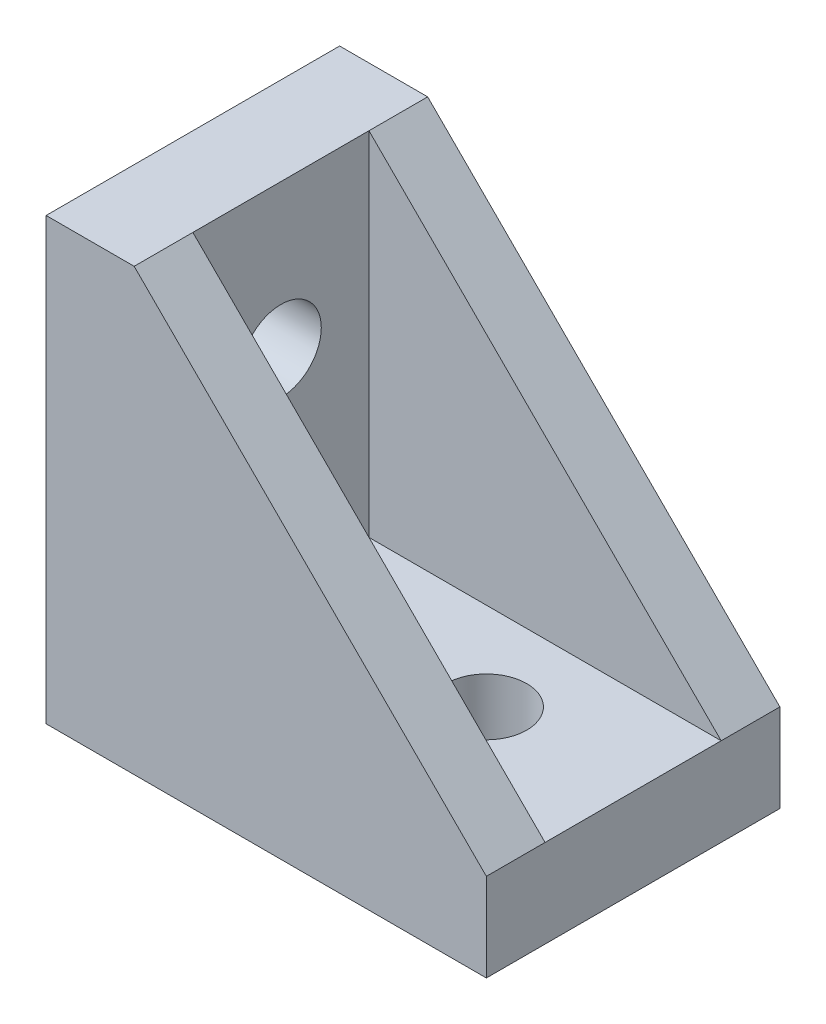
ISO-10303-21;
HEADER;
FILE_DESCRIPTION(('STEP AP214'),'2;1');
FILE_NAME('part.step','',(''),(''),'','','');
FILE_SCHEMA(('AUTOMOTIVE_DESIGN { 1 0 10303 214 1 1 1 1 }'));
ENDSEC;
DATA;
#1=APPLICATION_CONTEXT('core data for automotive mechanical design processes');
#2=APPLICATION_PROTOCOL_DEFINITION('international standard','automotive_design',2000,#1);
#3=PRODUCT_CONTEXT('',#1,'mechanical');
#4=PRODUCT('Part','Part','',(#3));
#5=PRODUCT_RELATED_PRODUCT_CATEGORY('part','',(#4));
#6=PRODUCT_DEFINITION_FORMATION('','',#4);
#7=PRODUCT_DEFINITION_CONTEXT('part definition',#1,'design');
#8=PRODUCT_DEFINITION('design','',#6,#7);
#9=PRODUCT_DEFINITION_SHAPE('','',#8);
#10=(LENGTH_UNIT() NAMED_UNIT(*) SI_UNIT(.MILLI.,.METRE.));
#11=(NAMED_UNIT(*) PLANE_ANGLE_UNIT() SI_UNIT($,.RADIAN.));
#12=(NAMED_UNIT(*) SI_UNIT($,.STERADIAN.) SOLID_ANGLE_UNIT());
#13=UNCERTAINTY_MEASURE_WITH_UNIT(LENGTH_MEASURE(1.E-05),#10,'distance_accuracy_value','');
#14=(GEOMETRIC_REPRESENTATION_CONTEXT(3) GLOBAL_UNCERTAINTY_ASSIGNED_CONTEXT((#13)) GLOBAL_UNIT_ASSIGNED_CONTEXT((#10,
#11,#12)) REPRESENTATION_CONTEXT('',''));
#15=CARTESIAN_POINT('',(0.,0.,0.));
#16=DIRECTION('',(0.,0.,1.));
#17=DIRECTION('',(1.,0.,0.));
#18=AXIS2_PLACEMENT_3D('',#15,#16,#17);
#19=CARTESIAN_POINT('',(6.,0.,10.));
#20=DIRECTION('',(1.,0.,0.));
#21=DIRECTION('',(0.,1.,0.));
#22=AXIS2_PLACEMENT_3D('',#19,#20,#21);
#23=PLANE('',#22);
#24=DIRECTION('',(0.,-1.,0.));
#25=VECTOR('',#24,1.);
#26=CARTESIAN_POINT('',(6.,6.,-6.));
#27=LINE('',#26,#25);
#28=CARTESIAN_POINT('',(6.,30.,-6.));
#29=VERTEX_POINT('',#28);
#30=CARTESIAN_POINT('',(6.,6.,-6.));
#31=VERTEX_POINT('',#30);
#32=EDGE_CURVE('E68',#29,#31,#27,.T.);
#33=ORIENTED_EDGE('',*,*,#32,.F.);
#34=DIRECTION('',(0.,0.,-1.));
#35=VECTOR('',#34,1.);
#36=CARTESIAN_POINT('',(6.,30.,10.));
#37=LINE('',#36,#35);
#38=CARTESIAN_POINT('',(6.,30.,6.));
#39=VERTEX_POINT('',#38);
#40=EDGE_CURVE('E12',#39,#29,#37,.T.);
#41=ORIENTED_EDGE('',*,*,#40,.F.);
#42=DIRECTION('',(0.,-1.,0.));
#43=VECTOR('',#42,1.);
#44=CARTESIAN_POINT('',(6.,6.,6.));
#45=LINE('',#44,#43);
#46=CARTESIAN_POINT('',(6.,6.,6.));
#47=VERTEX_POINT('',#46);
#48=EDGE_CURVE('E149',#39,#47,#45,.T.);
#49=ORIENTED_EDGE('',*,*,#48,.T.);
#50=DIRECTION('',(0.,0.,-1.));
#51=VECTOR('',#50,1.);
#52=CARTESIAN_POINT('',(6.,6.,10.));
#53=LINE('',#52,#51);
#54=EDGE_CURVE('E118',#47,#31,#53,.T.);
#55=ORIENTED_EDGE('',*,*,#54,.T.);
#56=EDGE_LOOP('',(#33,#41,#49,#55));
#57=FACE_BOUND('',#56,.T.);
#58=CARTESIAN_POINT('',(6.,20.,0.));
#59=DIRECTION('',(1.,0.,0.));
#60=DIRECTION('',(0.,0.,-1.));
#61=AXIS2_PLACEMENT_3D('',#58,#59,#60);
#62=CIRCLE('',#61,2.74999999999999);
#63=CARTESIAN_POINT('',(6.,20.,-2.74999999999999));
#64=VERTEX_POINT('',#63);
#65=EDGE_CURVE('E180',#64,#64,#62,.T.);
#66=ORIENTED_EDGE('',*,*,#65,.F.);
#67=EDGE_LOOP('',(#66));
#68=FACE_BOUND('',#67,.T.);
#69=ADVANCED_FACE('F46',(#57,#68),#23,.T.);
#70=CARTESIAN_POINT('',(0.,6.,10.));
#71=DIRECTION('',(0.,1.,0.));
#72=DIRECTION('',(1.,0.,0.));
#73=AXIS2_PLACEMENT_3D('',#70,#71,#72);
#74=PLANE('',#73);
#75=DIRECTION('',(1.,0.,0.));
#76=VECTOR('',#75,1.);
#77=CARTESIAN_POINT('',(6.,6.,-6.));
#78=LINE('',#77,#76);
#79=CARTESIAN_POINT('',(30.,6.00000000000001,-6.));
#80=VERTEX_POINT('',#79);
#81=EDGE_CURVE('E61',#31,#80,#78,.T.);
#82=ORIENTED_EDGE('',*,*,#81,.F.);
#83=ORIENTED_EDGE('',*,*,#54,.F.);
#84=DIRECTION('',(1.,0.,0.));
#85=VECTOR('',#84,1.);
#86=CARTESIAN_POINT('',(6.,6.,6.));
#87=LINE('',#86,#85);
#88=CARTESIAN_POINT('',(30.,5.99999999999999,6.));
#89=VERTEX_POINT('',#88);
#90=EDGE_CURVE('E115',#47,#89,#87,.T.);
#91=ORIENTED_EDGE('',*,*,#90,.T.);
#92=DIRECTION('',(0.,0.,-1.));
#93=VECTOR('',#92,1.);
#94=CARTESIAN_POINT('',(30.,5.99999999999999,10.));
#95=LINE('',#94,#93);
#96=EDGE_CURVE('E111',#89,#80,#95,.T.);
#97=ORIENTED_EDGE('',*,*,#96,.T.);
#98=EDGE_LOOP('',(#82,#83,#91,#97));
#99=FACE_BOUND('',#98,.T.);
#100=CARTESIAN_POINT('',(20.,6.,0.));
#101=DIRECTION('',(0.,-1.,0.));
#102=DIRECTION('',(0.,0.,-1.));
#103=AXIS2_PLACEMENT_3D('',#100,#101,#102);
#104=CIRCLE('',#103,2.74999999999999);
#105=CARTESIAN_POINT('',(20.,6.,-2.74999999999999));
#106=VERTEX_POINT('',#105);
#107=EDGE_CURVE('E159',#106,#106,#104,.T.);
#108=ORIENTED_EDGE('',*,*,#107,.T.);
#109=EDGE_LOOP('',(#108));
#110=FACE_BOUND('',#109,.T.);
#111=ADVANCED_FACE('F113',(#99,#110),#74,.T.);
#112=CARTESIAN_POINT('',(0.,0.,10.));
#113=DIRECTION('',(-1.,0.,0.));
#114=DIRECTION('',(0.,0.,1.));
#115=AXIS2_PLACEMENT_3D('',#112,#113,#114);
#116=PLANE('',#115);
#117=CARTESIAN_POINT('',(0.,20.,0.));
#118=DIRECTION('',(-1.,0.,0.));
#119=DIRECTION('',(0.,0.,1.));
#120=AXIS2_PLACEMENT_3D('',#117,#118,#119);
#121=CIRCLE('',#120,2.74999999999999);
#122=CARTESIAN_POINT('',(0.,20.,2.74999999999999));
#123=VERTEX_POINT('',#122);
#124=EDGE_CURVE('E183',#123,#123,#121,.T.);
#125=ORIENTED_EDGE('',*,*,#124,.F.);
#126=EDGE_LOOP('',(#125));
#127=FACE_BOUND('',#126,.T.);
#128=DIRECTION('',(0.,1.,0.));
#129=VECTOR('',#128,1.);
#130=CARTESIAN_POINT('',(0.,0.,-10.));
#131=LINE('',#130,#129);
#132=CARTESIAN_POINT('',(0.,0.,-10.));
#133=VERTEX_POINT('',#132);
#134=CARTESIAN_POINT('',(0.,30.,-10.));
#135=VERTEX_POINT('',#134);
#136=EDGE_CURVE('E186',#133,#135,#131,.T.);
#137=ORIENTED_EDGE('',*,*,#136,.F.);
#138=DIRECTION('',(0.,0.,-1.));
#139=VECTOR('',#138,1.);
#140=CARTESIAN_POINT('',(0.,0.,10.));
#141=LINE('',#140,#139);
#142=CARTESIAN_POINT('',(0.,0.,10.));
#143=VERTEX_POINT('',#142);
#144=EDGE_CURVE('E177',#143,#133,#141,.T.);
#145=ORIENTED_EDGE('',*,*,#144,.F.);
#146=DIRECTION('',(0.,1.,0.));
#147=VECTOR('',#146,1.);
#148=CARTESIAN_POINT('',(0.,0.,10.));
#149=LINE('',#148,#147);
#150=CARTESIAN_POINT('',(0.,30.,10.));
#151=VERTEX_POINT('',#150);
#152=EDGE_CURVE('E187',#143,#151,#149,.T.);
#153=ORIENTED_EDGE('',*,*,#152,.T.);
#154=DIRECTION('',(0.,0.,-1.));
#155=VECTOR('',#154,1.);
#156=CARTESIAN_POINT('',(0.,30.,10.));
#157=LINE('',#156,#155);
#158=EDGE_CURVE('E54',#151,#135,#157,.T.);
#159=ORIENTED_EDGE('',*,*,#158,.T.);
#160=EDGE_LOOP('',(#137,#145,#153,#159));
#161=FACE_BOUND('',#160,.T.);
#162=ADVANCED_FACE('F48',(#127,#161),#116,.T.);
#163=CARTESIAN_POINT('',(0.,30.,10.));
#164=DIRECTION('',(0.,1.,0.));
#165=DIRECTION('',(0.,0.,1.));
#166=AXIS2_PLACEMENT_3D('',#163,#164,#165);
#167=PLANE('',#166);
#168=DIRECTION('',(1.,0.,0.));
#169=VECTOR('',#168,1.);
#170=CARTESIAN_POINT('',(0.,30.,-10.));
#171=LINE('',#170,#169);
#172=CARTESIAN_POINT('',(6.,30.,-10.));
#173=VERTEX_POINT('',#172);
#174=EDGE_CURVE('E191',#135,#173,#171,.T.);
#175=ORIENTED_EDGE('',*,*,#174,.F.);
#176=ORIENTED_EDGE('',*,*,#158,.F.);
#177=DIRECTION('',(1.,0.,0.));
#178=VECTOR('',#177,1.);
#179=CARTESIAN_POINT('',(0.,30.,10.));
#180=LINE('',#179,#178);
#181=CARTESIAN_POINT('',(6.,30.,10.));
#182=VERTEX_POINT('',#181);
#183=EDGE_CURVE('E190',#151,#182,#180,.T.);
#184=ORIENTED_EDGE('',*,*,#183,.T.);
#185=DIRECTION('',(0.,0.,1.));
#186=VECTOR('',#185,1.);
#187=CARTESIAN_POINT('',(6.,30.,6.));
#188=LINE('',#187,#186);
#189=EDGE_CURVE('E157',#39,#182,#188,.T.);
#190=ORIENTED_EDGE('',*,*,#189,.F.);
#191=ORIENTED_EDGE('',*,*,#40,.T.);
#192=DIRECTION('',(0.,0.,-1.));
#193=VECTOR('',#192,1.);
#194=CARTESIAN_POINT('',(6.,30.,-6.));
#195=LINE('',#194,#193);
#196=EDGE_CURVE('E130',#29,#173,#195,.T.);
#197=ORIENTED_EDGE('',*,*,#196,.T.);
#198=EDGE_LOOP('',(#175,#176,#184,#190,#191,#197));
#199=FACE_BOUND('',#198,.T.);
#200=ADVANCED_FACE('F205',(#199),#167,.T.);
#201=CARTESIAN_POINT('',(0.,0.,10.));
#202=DIRECTION('',(0.,0.,1.));
#203=DIRECTION('',(1.,0.,0.));
#204=AXIS2_PLACEMENT_3D('',#201,#202,#203);
#205=PLANE('',#204);
#206=ORIENTED_EDGE('',*,*,#152,.F.);
#207=DIRECTION('',(1.,0.,0.));
#208=VECTOR('',#207,1.);
#209=CARTESIAN_POINT('',(0.,0.,10.));
#210=LINE('',#209,#208);
#211=CARTESIAN_POINT('',(30.,0.,10.));
#212=VERTEX_POINT('',#211);
#213=EDGE_CURVE('E166',#143,#212,#210,.T.);
#214=ORIENTED_EDGE('',*,*,#213,.T.);
#215=DIRECTION('',(0.,1.,0.));
#216=VECTOR('',#215,1.);
#217=CARTESIAN_POINT('',(30.,0.,10.));
#218=LINE('',#217,#216);
#219=CARTESIAN_POINT('',(30.,6.00000000000001,10.));
#220=VERTEX_POINT('',#219);
#221=EDGE_CURVE('E169',#212,#220,#218,.T.);
#222=ORIENTED_EDGE('',*,*,#221,.T.);
#223=DIRECTION('',(-0.707106781186548,0.707106781186547,0.));
#224=VECTOR('',#223,1.);
#225=CARTESIAN_POINT('',(6.,30.,10.));
#226=LINE('',#225,#224);
#227=EDGE_CURVE('E145',#220,#182,#226,.T.);
#228=ORIENTED_EDGE('',*,*,#227,.T.);
#229=ORIENTED_EDGE('',*,*,#183,.F.);
#230=EDGE_LOOP('',(#206,#214,#222,#228,#229));
#231=FACE_BOUND('',#230,.T.);
#232=ADVANCED_FACE('F216',(#231),#205,.T.);
#233=CARTESIAN_POINT('',(0.,0.,-10.));
#234=DIRECTION('',(0.,0.,1.));
#235=DIRECTION('',(1.,0.,0.));
#236=AXIS2_PLACEMENT_3D('',#233,#234,#235);
#237=PLANE('',#236);
#238=ORIENTED_EDGE('',*,*,#136,.T.);
#239=ORIENTED_EDGE('',*,*,#174,.T.);
#240=DIRECTION('',(-0.707106781186548,0.707106781186547,0.));
#241=VECTOR('',#240,1.);
#242=CARTESIAN_POINT('',(6.,30.,-10.));
#243=LINE('',#242,#241);
#244=CARTESIAN_POINT('',(30.,5.99999999999999,-10.));
#245=VERTEX_POINT('',#244);
#246=EDGE_CURVE('E139',#245,#173,#243,.T.);
#247=ORIENTED_EDGE('',*,*,#246,.F.);
#248=DIRECTION('',(0.,1.,0.));
#249=VECTOR('',#248,1.);
#250=CARTESIAN_POINT('',(30.,0.,-10.));
#251=LINE('',#250,#249);
#252=CARTESIAN_POINT('',(30.,0.,-10.));
#253=VERTEX_POINT('',#252);
#254=EDGE_CURVE('E125',#253,#245,#251,.T.);
#255=ORIENTED_EDGE('',*,*,#254,.F.);
#256=DIRECTION('',(1.,0.,0.));
#257=VECTOR('',#256,1.);
#258=CARTESIAN_POINT('',(0.,0.,-10.));
#259=LINE('',#258,#257);
#260=EDGE_CURVE('E165',#133,#253,#259,.T.);
#261=ORIENTED_EDGE('',*,*,#260,.F.);
#262=EDGE_LOOP('',(#238,#239,#247,#255,#261));
#263=FACE_BOUND('',#262,.T.);
#264=ADVANCED_FACE('F204',(#263),#237,.F.);
#265=CARTESIAN_POINT('',(6.,20.,0.));
#266=DIRECTION('',(1.,0.,0.));
#267=DIRECTION('',(0.,0.,-1.));
#268=AXIS2_PLACEMENT_3D('',#265,#266,#267);
#269=CYLINDRICAL_SURFACE('',#268,2.74999999999999);
#270=ORIENTED_EDGE('',*,*,#65,.T.);
#271=EDGE_LOOP('',(#270));
#272=FACE_BOUND('',#271,.T.);
#273=ORIENTED_EDGE('',*,*,#124,.T.);
#274=EDGE_LOOP('',(#273));
#275=FACE_BOUND('',#274,.T.);
#276=ADVANCED_FACE('F220',(#272,#275),#269,.F.);
#277=CARTESIAN_POINT('',(0.,0.,10.));
#278=DIRECTION('',(0.,-1.,0.));
#279=DIRECTION('',(0.,0.,1.));
#280=AXIS2_PLACEMENT_3D('',#277,#278,#279);
#281=PLANE('',#280);
#282=CARTESIAN_POINT('',(20.,0.,0.));
#283=DIRECTION('',(0.,1.,0.));
#284=DIRECTION('',(0.,0.,1.));
#285=AXIS2_PLACEMENT_3D('',#282,#283,#284);
#286=CIRCLE('',#285,2.74999999999999);
#287=CARTESIAN_POINT('',(20.,0.,2.74999999999999));
#288=VERTEX_POINT('',#287);
#289=EDGE_CURVE('E162',#288,#288,#286,.T.);
#290=ORIENTED_EDGE('',*,*,#289,.T.);
#291=EDGE_LOOP('',(#290));
#292=FACE_BOUND('',#291,.T.);
#293=ORIENTED_EDGE('',*,*,#260,.T.);
#294=DIRECTION('',(0.,0.,-1.));
#295=VECTOR('',#294,1.);
#296=CARTESIAN_POINT('',(30.,0.,10.));
#297=LINE('',#296,#295);
#298=EDGE_CURVE('E119',#212,#253,#297,.T.);
#299=ORIENTED_EDGE('',*,*,#298,.F.);
#300=ORIENTED_EDGE('',*,*,#213,.F.);
#301=ORIENTED_EDGE('',*,*,#144,.T.);
#302=EDGE_LOOP('',(#293,#299,#300,#301));
#303=FACE_BOUND('',#302,.T.);
#304=ADVANCED_FACE('F218',(#292,#303),#281,.T.);
#305=CARTESIAN_POINT('',(30.,0.,10.));
#306=DIRECTION('',(1.,0.,0.));
#307=DIRECTION('',(0.,0.,1.));
#308=AXIS2_PLACEMENT_3D('',#305,#306,#307);
#309=PLANE('',#308);
#310=ORIENTED_EDGE('',*,*,#254,.T.);
#311=DIRECTION('',(0.,0.,-1.));
#312=VECTOR('',#311,1.);
#313=CARTESIAN_POINT('',(30.,6.00000000000001,-6.));
#314=LINE('',#313,#312);
#315=EDGE_CURVE('E122',#80,#245,#314,.T.);
#316=ORIENTED_EDGE('',*,*,#315,.F.);
#317=ORIENTED_EDGE('',*,*,#96,.F.);
#318=DIRECTION('',(0.,0.,1.));
#319=VECTOR('',#318,1.);
#320=CARTESIAN_POINT('',(30.,6.00000000000001,6.));
#321=LINE('',#320,#319);
#322=EDGE_CURVE('E153',#89,#220,#321,.T.);
#323=ORIENTED_EDGE('',*,*,#322,.T.);
#324=ORIENTED_EDGE('',*,*,#221,.F.);
#325=ORIENTED_EDGE('',*,*,#298,.T.);
#326=EDGE_LOOP('',(#310,#316,#317,#323,#324,#325));
#327=FACE_BOUND('',#326,.T.);
#328=ADVANCED_FACE('F123',(#327),#309,.T.);
#329=CARTESIAN_POINT('',(20.,6.,0.));
#330=DIRECTION('',(0.,1.,0.));
#331=DIRECTION('',(0.,0.,-1.));
#332=AXIS2_PLACEMENT_3D('',#329,#330,#331);
#333=CYLINDRICAL_SURFACE('',#332,2.74999999999999);
#334=ORIENTED_EDGE('',*,*,#107,.F.);
#335=EDGE_LOOP('',(#334));
#336=FACE_BOUND('',#335,.T.);
#337=ORIENTED_EDGE('',*,*,#289,.F.);
#338=EDGE_LOOP('',(#337));
#339=FACE_BOUND('',#338,.T.);
#340=ADVANCED_FACE('F229',(#336,#339),#333,.F.);
#341=CARTESIAN_POINT('',(6.,30.,6.));
#342=DIRECTION('',(-0.707106781186547,-0.707106781186548,0.));
#343=DIRECTION('',(0.707106781186548,-0.707106781186547,0.));
#344=AXIS2_PLACEMENT_3D('',#341,#342,#343);
#345=PLANE('',#344);
#346=ORIENTED_EDGE('',*,*,#227,.F.);
#347=ORIENTED_EDGE('',*,*,#322,.F.);
#348=DIRECTION('',(-0.707106781186548,0.707106781186547,0.));
#349=VECTOR('',#348,1.);
#350=CARTESIAN_POINT('',(6.,30.,6.));
#351=LINE('',#350,#349);
#352=EDGE_CURVE('E146',#89,#39,#351,.T.);
#353=ORIENTED_EDGE('',*,*,#352,.T.);
#354=ORIENTED_EDGE('',*,*,#189,.T.);
#355=EDGE_LOOP('',(#346,#347,#353,#354));
#356=FACE_BOUND('',#355,.T.);
#357=ADVANCED_FACE('F212',(#356),#345,.F.);
#358=CARTESIAN_POINT('',(0.,0.,6.));
#359=DIRECTION('',(0.,0.,-1.));
#360=DIRECTION('',(1.,0.,0.));
#361=AXIS2_PLACEMENT_3D('',#358,#359,#360);
#362=PLANE('',#361);
#363=ORIENTED_EDGE('',*,*,#352,.F.);
#364=ORIENTED_EDGE('',*,*,#90,.F.);
#365=ORIENTED_EDGE('',*,*,#48,.F.);
#366=EDGE_LOOP('',(#363,#364,#365));
#367=FACE_BOUND('',#366,.T.);
#368=ADVANCED_FACE('F210',(#367),#362,.T.);
#369=CARTESIAN_POINT('',(6.,30.,-6.));
#370=DIRECTION('',(-0.707106781186547,-0.707106781186548,0.));
#371=DIRECTION('',(0.707106781186548,-0.707106781186547,0.));
#372=AXIS2_PLACEMENT_3D('',#369,#370,#371);
#373=PLANE('',#372);
#374=ORIENTED_EDGE('',*,*,#246,.T.);
#375=ORIENTED_EDGE('',*,*,#196,.F.);
#376=DIRECTION('',(-0.707106781186548,0.707106781186547,0.));
#377=VECTOR('',#376,1.);
#378=CARTESIAN_POINT('',(6.,30.,-6.));
#379=LINE('',#378,#377);
#380=EDGE_CURVE('E135',#80,#29,#379,.T.);
#381=ORIENTED_EDGE('',*,*,#380,.F.);
#382=ORIENTED_EDGE('',*,*,#315,.T.);
#383=EDGE_LOOP('',(#374,#375,#381,#382));
#384=FACE_BOUND('',#383,.T.);
#385=ADVANCED_FACE('F138',(#384),#373,.F.);
#386=CARTESIAN_POINT('',(0.,0.,-6.));
#387=DIRECTION('',(0.,0.,1.));
#388=DIRECTION('',(1.,0.,0.));
#389=AXIS2_PLACEMENT_3D('',#386,#387,#388);
#390=PLANE('',#389);
#391=ORIENTED_EDGE('',*,*,#380,.T.);
#392=ORIENTED_EDGE('',*,*,#32,.T.);
#393=ORIENTED_EDGE('',*,*,#81,.T.);
#394=EDGE_LOOP('',(#391,#392,#393));
#395=FACE_BOUND('',#394,.T.);
#396=ADVANCED_FACE('F134',(#395),#390,.T.);
#397=CLOSED_SHELL('',(#69,#111,#162,#200,#232,#264,#276,#304,#328,#340,#357,#368,#385,#396));
#398=MANIFOLD_SOLID_BREP('B2',#397);
#399=ADVANCED_BREP_SHAPE_REPRESENTATION('',(#18,#398),#14);
#400=SHAPE_DEFINITION_REPRESENTATION(#9,#399);
ENDSEC;
END-ISO-10303-21;
